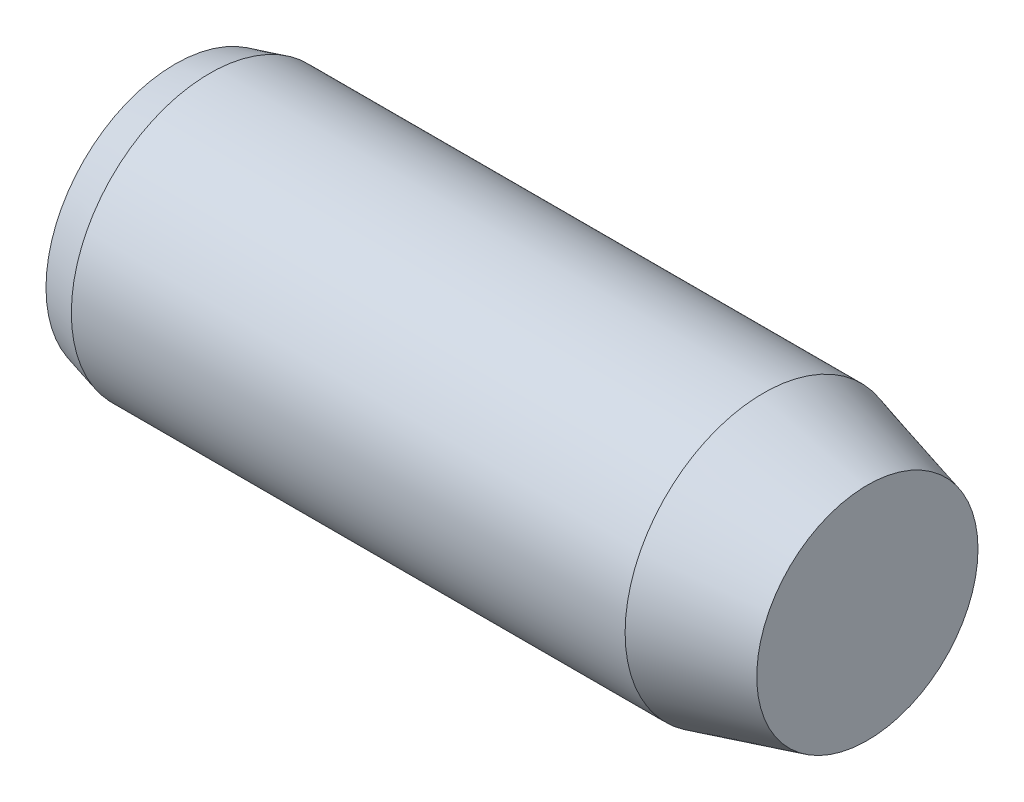
ISO-10303-21;
HEADER;
FILE_DESCRIPTION(('STEP AP214'),'2;1');
FILE_NAME('part.step','',(''),(''),'','','');
FILE_SCHEMA(('AUTOMOTIVE_DESIGN { 1 0 10303 214 1 1 1 1 }'));
ENDSEC;
DATA;
#1=APPLICATION_CONTEXT('core data for automotive mechanical design processes');
#2=APPLICATION_PROTOCOL_DEFINITION('international standard','automotive_design',2000,#1);
#3=PRODUCT_CONTEXT('',#1,'mechanical');
#4=PRODUCT('Part','Part','',(#3));
#5=PRODUCT_RELATED_PRODUCT_CATEGORY('part','',(#4));
#6=PRODUCT_DEFINITION_FORMATION('','',#4);
#7=PRODUCT_DEFINITION_CONTEXT('part definition',#1,'design');
#8=PRODUCT_DEFINITION('design','',#6,#7);
#9=PRODUCT_DEFINITION_SHAPE('','',#8);
#10=(LENGTH_UNIT() NAMED_UNIT(*) SI_UNIT(.MILLI.,.METRE.));
#11=(NAMED_UNIT(*) PLANE_ANGLE_UNIT() SI_UNIT($,.RADIAN.));
#12=(NAMED_UNIT(*) SI_UNIT($,.STERADIAN.) SOLID_ANGLE_UNIT());
#13=UNCERTAINTY_MEASURE_WITH_UNIT(LENGTH_MEASURE(1.E-05),#10,'distance_accuracy_value','');
#14=(GEOMETRIC_REPRESENTATION_CONTEXT(3) GLOBAL_UNCERTAINTY_ASSIGNED_CONTEXT((#13)) GLOBAL_UNIT_ASSIGNED_CONTEXT((#10,
#11,#12)) REPRESENTATION_CONTEXT('',''));
#15=CARTESIAN_POINT('',(0.,0.,0.));
#16=DIRECTION('',(0.,0.,1.));
#17=DIRECTION('',(1.,0.,0.));
#18=AXIS2_PLACEMENT_3D('',#15,#16,#17);
#19=CARTESIAN_POINT('',(-5.,0.,0.));
#20=DIRECTION('',(1.,0.,0.));
#21=DIRECTION('',(0.,0.,-1.));
#22=AXIS2_PLACEMENT_3D('',#19,#20,#21);
#23=PLANE('',#22);
#24=CARTESIAN_POINT('',(-5.,0.,0.));
#25=DIRECTION('',(1.,0.,0.));
#26=DIRECTION('',(0.,0.,-1.));
#27=AXIS2_PLACEMENT_3D('',#24,#25,#26);
#28=CIRCLE('',#27,1.86602540378444);
#29=CARTESIAN_POINT('',(-5.,0.,-1.86602540378445));
#30=VERTEX_POINT('',#29);
#31=EDGE_CURVE('E10',#30,#30,#28,.T.);
#32=ORIENTED_EDGE('',*,*,#31,.F.);
#33=EDGE_LOOP('',(#32));
#34=FACE_BOUND('',#33,.T.);
#35=ADVANCED_FACE('F14',(#34),#23,.F.);
#36=CARTESIAN_POINT('',(-5.,0.,0.));
#37=DIRECTION('',(1.,0.,0.));
#38=DIRECTION('',(0.,0.,-1.));
#39=AXIS2_PLACEMENT_3D('',#36,#37,#38);
#40=CONICAL_SURFACE('',#39,1.86602540378444,0.26179938779915);
#41=CARTESIAN_POINT('',(-4.5,0.,0.));
#42=DIRECTION('',(1.,0.,0.));
#43=DIRECTION('',(0.,0.,-1.));
#44=AXIS2_PLACEMENT_3D('',#41,#42,#43);
#45=CIRCLE('',#44,2.);
#46=CARTESIAN_POINT('',(-4.5,0.,-2.00000000000001));
#47=VERTEX_POINT('',#46);
#48=EDGE_CURVE('E20',#47,#47,#45,.T.);
#49=ORIENTED_EDGE('',*,*,#48,.F.);
#50=EDGE_LOOP('',(#49));
#51=FACE_BOUND('',#50,.T.);
#52=ORIENTED_EDGE('',*,*,#31,.T.);
#53=EDGE_LOOP('',(#52));
#54=FACE_BOUND('',#53,.T.);
#55=ADVANCED_FACE('F44',(#51,#54),#40,.T.);
#56=CARTESIAN_POINT('',(5.,0.,0.));
#57=DIRECTION('',(1.,0.,0.));
#58=DIRECTION('',(0.,0.,-1.));
#59=AXIS2_PLACEMENT_3D('',#56,#57,#58);
#60=CYLINDRICAL_SURFACE('',#59,2.);
#61=CARTESIAN_POINT('',(3.5,0.,0.));
#62=DIRECTION('',(1.,0.,0.));
#63=DIRECTION('',(0.,0.,-1.));
#64=AXIS2_PLACEMENT_3D('',#61,#62,#63);
#65=CIRCLE('',#64,2.);
#66=CARTESIAN_POINT('',(3.5,0.,-2.00000000000001));
#67=VERTEX_POINT('',#66);
#68=EDGE_CURVE('E24',#67,#67,#65,.T.);
#69=ORIENTED_EDGE('',*,*,#68,.F.);
#70=EDGE_LOOP('',(#69));
#71=FACE_BOUND('',#70,.T.);
#72=ORIENTED_EDGE('',*,*,#48,.T.);
#73=EDGE_LOOP('',(#72));
#74=FACE_BOUND('',#73,.T.);
#75=ADVANCED_FACE('F39',(#71,#74),#60,.T.);
#76=CARTESIAN_POINT('',(3.5,0.,0.));
#77=DIRECTION('',(-1.,0.,0.));
#78=DIRECTION('',(0.,0.,1.));
#79=AXIS2_PLACEMENT_3D('',#76,#77,#78);
#80=CONICAL_SURFACE('',#79,2.,0.261799387799149);
#81=CARTESIAN_POINT('',(5.,0.,0.));
#82=DIRECTION('',(1.,0.,0.));
#83=DIRECTION('',(0.,0.,-1.));
#84=AXIS2_PLACEMENT_3D('',#81,#82,#83);
#85=CIRCLE('',#84,1.59807621135332);
#86=CARTESIAN_POINT('',(5.,0.,-1.59807621135332));
#87=VERTEX_POINT('',#86);
#88=EDGE_CURVE('E28',#87,#87,#85,.T.);
#89=ORIENTED_EDGE('',*,*,#88,.F.);
#90=EDGE_LOOP('',(#89));
#91=FACE_BOUND('',#90,.T.);
#92=ORIENTED_EDGE('',*,*,#68,.T.);
#93=EDGE_LOOP('',(#92));
#94=FACE_BOUND('',#93,.T.);
#95=ADVANCED_FACE('F36',(#91,#94),#80,.T.);
#96=CARTESIAN_POINT('',(5.,1.59807621135332,0.));
#97=DIRECTION('',(-1.,0.,0.));
#98=DIRECTION('',(0.,0.,1.));
#99=AXIS2_PLACEMENT_3D('',#96,#97,#98);
#100=PLANE('',#99);
#101=ORIENTED_EDGE('',*,*,#88,.T.);
#102=EDGE_LOOP('',(#101));
#103=FACE_BOUND('',#102,.T.);
#104=ADVANCED_FACE('F34',(#103),#100,.F.);
#105=CLOSED_SHELL('',(#35,#55,#75,#95,#104));
#106=MANIFOLD_SOLID_BREP('B1',#105);
#107=ADVANCED_BREP_SHAPE_REPRESENTATION('',(#18,#106),#14);
#108=SHAPE_DEFINITION_REPRESENTATION(#9,#107);
ENDSEC;
END-ISO-10303-21;
